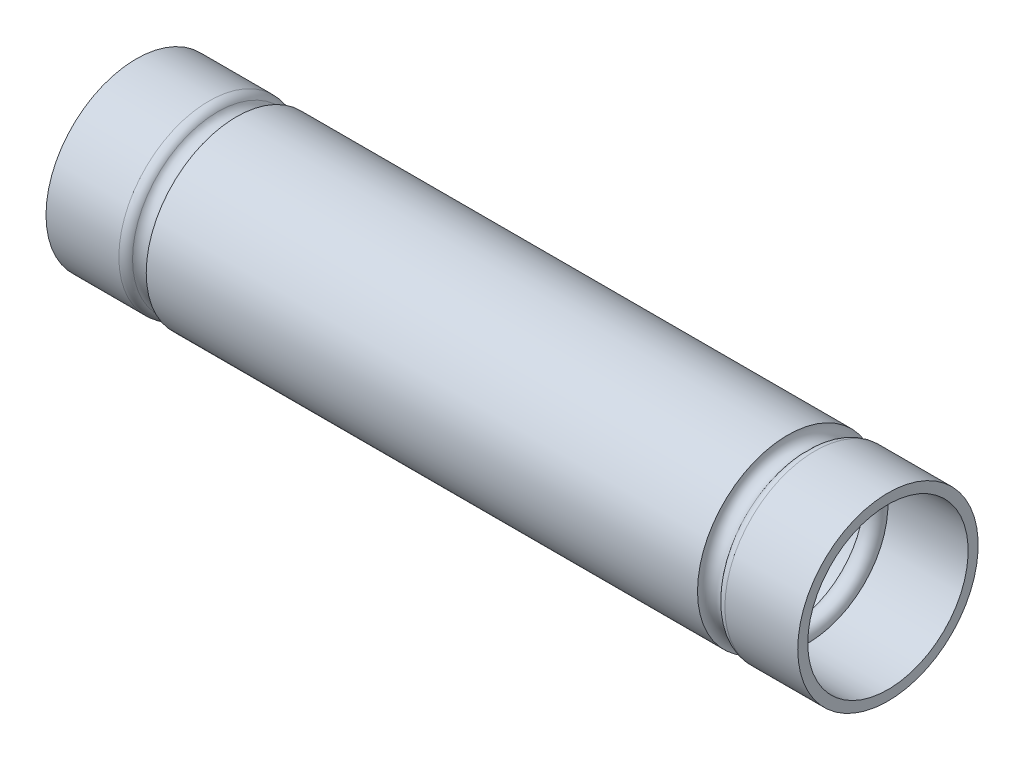
ISO-10303-21;
HEADER;
FILE_DESCRIPTION(('STEP AP214'),'2;1');
FILE_NAME('part.step','',(''),(''),'','','');
FILE_SCHEMA(('AUTOMOTIVE_DESIGN { 1 0 10303 214 1 1 1 1 }'));
ENDSEC;
DATA;
#1=APPLICATION_CONTEXT('core data for automotive mechanical design processes');
#2=APPLICATION_PROTOCOL_DEFINITION('international standard','automotive_design',2000,#1);
#3=PRODUCT_CONTEXT('',#1,'mechanical');
#4=PRODUCT('Part','Part','',(#3));
#5=PRODUCT_RELATED_PRODUCT_CATEGORY('part','',(#4));
#6=PRODUCT_DEFINITION_FORMATION('','',#4);
#7=PRODUCT_DEFINITION_CONTEXT('part definition',#1,'design');
#8=PRODUCT_DEFINITION('design','',#6,#7);
#9=PRODUCT_DEFINITION_SHAPE('','',#8);
#10=(LENGTH_UNIT() NAMED_UNIT(*) SI_UNIT(.MILLI.,.METRE.));
#11=(NAMED_UNIT(*) PLANE_ANGLE_UNIT() SI_UNIT($,.RADIAN.));
#12=(NAMED_UNIT(*) SI_UNIT($,.STERADIAN.) SOLID_ANGLE_UNIT());
#13=UNCERTAINTY_MEASURE_WITH_UNIT(LENGTH_MEASURE(1.E-05),#10,'distance_accuracy_value','');
#14=(GEOMETRIC_REPRESENTATION_CONTEXT(3) GLOBAL_UNCERTAINTY_ASSIGNED_CONTEXT((#13)) GLOBAL_UNIT_ASSIGNED_CONTEXT((#10,
#11,#12)) REPRESENTATION_CONTEXT('',''));
#15=CARTESIAN_POINT('',(0.,0.,0.));
#16=DIRECTION('',(0.,0.,1.));
#17=DIRECTION('',(1.,0.,0.));
#18=AXIS2_PLACEMENT_3D('',#15,#16,#17);
#19=CARTESIAN_POINT('',(33.0000000000164,0.,0.));
#20=DIRECTION('',(-1.,0.,0.));
#21=DIRECTION('',(0.,0.,1.));
#22=AXIS2_PLACEMENT_3D('',#19,#20,#21);
#23=TOROIDAL_SURFACE('',#22,4.00000000000052,0.5);
#24=CARTESIAN_POINT('',(32.5000000000164,0.,0.));
#25=DIRECTION('',(-1.,0.,0.));
#26=DIRECTION('',(0.,0.,1.));
#27=AXIS2_PLACEMENT_3D('',#24,#25,#26);
#28=CIRCLE('',#27,4.00000000000053);
#29=CARTESIAN_POINT('',(32.5000000000164,0.,4.00000000000053));
#30=VERTEX_POINT('',#29);
#31=EDGE_CURVE('E67',#30,#30,#28,.T.);
#32=ORIENTED_EDGE('',*,*,#31,.T.);
#33=EDGE_LOOP('',(#32));
#34=FACE_BOUND('',#33,.T.);
#35=CARTESIAN_POINT('',(33.5000000000164,0.,0.));
#36=DIRECTION('',(-1.,0.,0.));
#37=DIRECTION('',(0.,0.,1.));
#38=AXIS2_PLACEMENT_3D('',#35,#36,#37);
#39=CIRCLE('',#38,4.00000000000052);
#40=CARTESIAN_POINT('',(33.5000000000164,0.,4.00000000000052));
#41=VERTEX_POINT('',#40);
#42=EDGE_CURVE('E103',#41,#41,#39,.T.);
#43=ORIENTED_EDGE('',*,*,#42,.F.);
#44=EDGE_LOOP('',(#43));
#45=FACE_BOUND('',#44,.T.);
#46=ADVANCED_FACE('F43',(#34,#45),#23,.T.);
#47=CARTESIAN_POINT('',(37.4999999999977,0.,0.));
#48=DIRECTION('',(-1.,0.,0.));
#49=DIRECTION('',(0.,0.,1.));
#50=AXIS2_PLACEMENT_3D('',#47,#48,#49);
#51=CYLINDRICAL_SURFACE('',#50,4.00000000000053);
#52=CARTESIAN_POINT('',(4.99999999998123,0.,0.));
#53=DIRECTION('',(-1.,0.,0.));
#54=DIRECTION('',(0.,0.,1.));
#55=AXIS2_PLACEMENT_3D('',#52,#53,#54);
#56=CIRCLE('',#55,4.00000000000053);
#57=CARTESIAN_POINT('',(4.99999999998123,0.,4.00000000000053));
#58=VERTEX_POINT('',#57);
#59=EDGE_CURVE('E71',#58,#58,#56,.T.);
#60=ORIENTED_EDGE('',*,*,#59,.T.);
#61=EDGE_LOOP('',(#60));
#62=FACE_BOUND('',#61,.T.);
#63=ORIENTED_EDGE('',*,*,#31,.F.);
#64=EDGE_LOOP('',(#63));
#65=FACE_BOUND('',#64,.T.);
#66=ADVANCED_FACE('F112',(#62,#65),#51,.F.);
#67=CARTESIAN_POINT('',(4.49999999998124,0.,0.));
#68=DIRECTION('',(-1.,0.,0.));
#69=DIRECTION('',(0.,0.,1.));
#70=AXIS2_PLACEMENT_3D('',#67,#68,#69);
#71=TOROIDAL_SURFACE('',#70,4.00000000000053,0.5);
#72=CARTESIAN_POINT('',(3.99999999998123,0.,0.));
#73=DIRECTION('',(-1.,0.,0.));
#74=DIRECTION('',(0.,0.,1.));
#75=AXIS2_PLACEMENT_3D('',#72,#73,#74);
#76=CIRCLE('',#75,4.00000000000053);
#77=CARTESIAN_POINT('',(3.99999999998123,0.,4.00000000000053));
#78=VERTEX_POINT('',#77);
#79=EDGE_CURVE('E75',#78,#78,#76,.T.);
#80=ORIENTED_EDGE('',*,*,#79,.T.);
#81=EDGE_LOOP('',(#80));
#82=FACE_BOUND('',#81,.T.);
#83=ORIENTED_EDGE('',*,*,#59,.F.);
#84=EDGE_LOOP('',(#83));
#85=FACE_BOUND('',#84,.T.);
#86=ADVANCED_FACE('F118',(#82,#85),#71,.T.);
#87=CARTESIAN_POINT('',(37.4999999999977,0.,0.));
#88=DIRECTION('',(-1.,0.,0.));
#89=DIRECTION('',(0.,0.,1.));
#90=AXIS2_PLACEMENT_3D('',#87,#88,#89);
#91=CYLINDRICAL_SURFACE('',#90,4.00000000000053);
#92=CARTESIAN_POINT('',(0.,0.,0.));
#93=DIRECTION('',(-1.,0.,0.));
#94=DIRECTION('',(0.,0.,1.));
#95=AXIS2_PLACEMENT_3D('',#92,#93,#94);
#96=CIRCLE('',#95,4.00000000000053);
#97=CARTESIAN_POINT('',(0.,0.,4.00000000000053));
#98=VERTEX_POINT('',#97);
#99=EDGE_CURVE('E79',#98,#98,#96,.T.);
#100=ORIENTED_EDGE('',*,*,#99,.T.);
#101=EDGE_LOOP('',(#100));
#102=FACE_BOUND('',#101,.T.);
#103=ORIENTED_EDGE('',*,*,#79,.F.);
#104=EDGE_LOOP('',(#103));
#105=FACE_BOUND('',#104,.T.);
#106=ADVANCED_FACE('F162',(#102,#105),#91,.F.);
#107=CARTESIAN_POINT('',(0.,4.00000000000053,0.));
#108=DIRECTION('',(-1.,0.,0.));
#109=DIRECTION('',(0.,0.,1.));
#110=AXIS2_PLACEMENT_3D('',#107,#108,#109);
#111=PLANE('',#110);
#112=CARTESIAN_POINT('',(0.,0.,0.));
#113=DIRECTION('',(-1.,0.,0.));
#114=DIRECTION('',(0.,0.,1.));
#115=AXIS2_PLACEMENT_3D('',#112,#113,#114);
#116=CIRCLE('',#115,4.50000000000052);
#117=CARTESIAN_POINT('',(0.,0.,4.50000000000052));
#118=VERTEX_POINT('',#117);
#119=EDGE_CURVE('E83',#118,#118,#116,.T.);
#120=ORIENTED_EDGE('',*,*,#119,.T.);
#121=EDGE_LOOP('',(#120));
#122=FACE_BOUND('',#121,.T.);
#123=ORIENTED_EDGE('',*,*,#99,.F.);
#124=EDGE_LOOP('',(#123));
#125=FACE_BOUND('',#124,.T.);
#126=ADVANCED_FACE('F157',(#122,#125),#111,.T.);
#127=CARTESIAN_POINT('',(37.4999999999977,0.,0.));
#128=DIRECTION('',(-1.,0.,0.));
#129=DIRECTION('',(0.,0.,1.));
#130=AXIS2_PLACEMENT_3D('',#127,#128,#129);
#131=CYLINDRICAL_SURFACE('',#130,4.50000000000052);
#132=CARTESIAN_POINT('',(3.63397622195295,0.,0.));
#133=DIRECTION('',(1.,0.,0.));
#134=DIRECTION('',(0.,0.,-1.));
#135=AXIS2_PLACEMENT_3D('',#132,#133,#134);
#136=CIRCLE('',#135,4.50000000000052);
#137=CARTESIAN_POINT('',(3.63397622195295,0.,-4.50000000000052));
#138=VERTEX_POINT('',#137);
#139=EDGE_CURVE('E51',#138,#138,#136,.F.);
#140=ORIENTED_EDGE('',*,*,#139,.T.);
#141=EDGE_LOOP('',(#140));
#142=FACE_BOUND('',#141,.T.);
#143=ORIENTED_EDGE('',*,*,#119,.F.);
#144=EDGE_LOOP('',(#143));
#145=FACE_BOUND('',#144,.T.);
#146=ADVANCED_FACE('F152',(#142,#145),#131,.T.);
#147=CARTESIAN_POINT('',(4.49999999998123,0.,0.));
#148=DIRECTION('',(-1.,0.,0.));
#149=DIRECTION('',(0.,0.,1.));
#150=AXIS2_PLACEMENT_3D('',#147,#148,#149);
#151=TOROIDAL_SURFACE('',#150,4.50000000000052,0.5);
#152=CARTESIAN_POINT('',(4.06698689164988,0.,0.));
#153=DIRECTION('',(1.,0.,0.));
#154=DIRECTION('',(0.,0.,-1.));
#155=AXIS2_PLACEMENT_3D('',#152,#153,#154);
#156=CIRCLE('',#155,4.25000070397509);
#157=CARTESIAN_POINT('',(4.06698689164988,0.,-4.25000070397509));
#158=VERTEX_POINT('',#157);
#159=EDGE_CURVE('E10',#158,#158,#156,.T.);
#160=ORIENTED_EDGE('',*,*,#159,.T.);
#161=EDGE_LOOP('',(#160));
#162=FACE_BOUND('',#161,.T.);
#163=CARTESIAN_POINT('',(4.99999999998123,0.,0.));
#164=DIRECTION('',(-1.,0.,0.));
#165=DIRECTION('',(0.,0.,1.));
#166=AXIS2_PLACEMENT_3D('',#163,#164,#165);
#167=CIRCLE('',#166,4.50000000000052);
#168=CARTESIAN_POINT('',(4.99999999998123,0.,4.50000000000052));
#169=VERTEX_POINT('',#168);
#170=EDGE_CURVE('E87',#169,#169,#167,.T.);
#171=ORIENTED_EDGE('',*,*,#170,.T.);
#172=EDGE_LOOP('',(#171));
#173=FACE_BOUND('',#172,.T.);
#174=ADVANCED_FACE('F147',(#162,#173),#151,.F.);
#175=CARTESIAN_POINT('',(37.4999999999977,0.,0.));
#176=DIRECTION('',(-1.,0.,0.));
#177=DIRECTION('',(0.,0.,1.));
#178=AXIS2_PLACEMENT_3D('',#175,#176,#177);
#179=CYLINDRICAL_SURFACE('',#178,4.50000000000052);
#180=CARTESIAN_POINT('',(32.5000000000164,0.,0.));
#181=DIRECTION('',(-1.,0.,0.));
#182=DIRECTION('',(0.,0.,1.));
#183=AXIS2_PLACEMENT_3D('',#180,#181,#182);
#184=CIRCLE('',#183,4.50000000000053);
#185=CARTESIAN_POINT('',(32.5000000000164,0.,4.50000000000053));
#186=VERTEX_POINT('',#185);
#187=EDGE_CURVE('E91',#186,#186,#184,.T.);
#188=ORIENTED_EDGE('',*,*,#187,.T.);
#189=EDGE_LOOP('',(#188));
#190=FACE_BOUND('',#189,.T.);
#191=ORIENTED_EDGE('',*,*,#170,.F.);
#192=EDGE_LOOP('',(#191));
#193=FACE_BOUND('',#192,.T.);
#194=ADVANCED_FACE('F141',(#190,#193),#179,.T.);
#195=CARTESIAN_POINT('',(33.0000000000164,0.,0.));
#196=DIRECTION('',(-1.,0.,0.));
#197=DIRECTION('',(0.,0.,1.));
#198=AXIS2_PLACEMENT_3D('',#195,#196,#197);
#199=TOROIDAL_SURFACE('',#198,4.50000000000023,0.5);
#200=CARTESIAN_POINT('',(33.4330131083478,0.,0.));
#201=DIRECTION('',(-1.,0.,0.));
#202=DIRECTION('',(0.,0.,1.));
#203=AXIS2_PLACEMENT_3D('',#200,#201,#202);
#204=CIRCLE('',#203,4.25000070397485);
#205=CARTESIAN_POINT('',(33.4330131083478,0.,4.25000070397485));
#206=VERTEX_POINT('',#205);
#207=EDGE_CURVE('E61',#206,#206,#204,.T.);
#208=ORIENTED_EDGE('',*,*,#207,.T.);
#209=EDGE_LOOP('',(#208));
#210=FACE_BOUND('',#209,.T.);
#211=ORIENTED_EDGE('',*,*,#187,.F.);
#212=EDGE_LOOP('',(#211));
#213=FACE_BOUND('',#212,.T.);
#214=ADVANCED_FACE('F137',(#210,#213),#199,.F.);
#215=CARTESIAN_POINT('',(37.4999999999977,0.,0.));
#216=DIRECTION('',(-1.,0.,0.));
#217=DIRECTION('',(0.,0.,1.));
#218=AXIS2_PLACEMENT_3D('',#215,#216,#217);
#219=CYLINDRICAL_SURFACE('',#218,4.50000000000037);
#220=CARTESIAN_POINT('',(33.8660237780448,0.,0.));
#221=DIRECTION('',(1.,0.,0.));
#222=DIRECTION('',(0.,0.,-1.));
#223=AXIS2_PLACEMENT_3D('',#220,#221,#222);
#224=CIRCLE('',#223,4.50000000000037);
#225=CARTESIAN_POINT('',(33.8660237780448,0.,-4.50000000000037));
#226=VERTEX_POINT('',#225);
#227=EDGE_CURVE('E56',#226,#226,#224,.T.);
#228=ORIENTED_EDGE('',*,*,#227,.T.);
#229=EDGE_LOOP('',(#228));
#230=FACE_BOUND('',#229,.T.);
#231=CARTESIAN_POINT('',(37.4999999999977,0.,0.));
#232=DIRECTION('',(-1.,0.,0.));
#233=DIRECTION('',(0.,0.,1.));
#234=AXIS2_PLACEMENT_3D('',#231,#232,#233);
#235=CIRCLE('',#234,4.50000000000052);
#236=CARTESIAN_POINT('',(37.4999999999977,0.,4.50000000000052));
#237=VERTEX_POINT('',#236);
#238=EDGE_CURVE('E95',#237,#237,#235,.T.);
#239=ORIENTED_EDGE('',*,*,#238,.T.);
#240=EDGE_LOOP('',(#239));
#241=FACE_BOUND('',#240,.T.);
#242=ADVANCED_FACE('F140',(#230,#241),#219,.T.);
#243=CARTESIAN_POINT('',(37.4999999999977,4.50000000000052,0.));
#244=DIRECTION('',(1.,0.,0.));
#245=DIRECTION('',(0.,0.,-1.));
#246=AXIS2_PLACEMENT_3D('',#243,#244,#245);
#247=PLANE('',#246);
#248=CARTESIAN_POINT('',(37.4999999999977,0.,0.));
#249=DIRECTION('',(-1.,0.,0.));
#250=DIRECTION('',(0.,0.,1.));
#251=AXIS2_PLACEMENT_3D('',#248,#249,#250);
#252=CIRCLE('',#251,4.00000000000052);
#253=CARTESIAN_POINT('',(37.4999999999977,0.,4.00000000000052));
#254=VERTEX_POINT('',#253);
#255=EDGE_CURVE('E99',#254,#254,#252,.T.);
#256=ORIENTED_EDGE('',*,*,#255,.T.);
#257=EDGE_LOOP('',(#256));
#258=FACE_BOUND('',#257,.T.);
#259=ORIENTED_EDGE('',*,*,#238,.F.);
#260=EDGE_LOOP('',(#259));
#261=FACE_BOUND('',#260,.T.);
#262=ADVANCED_FACE('F131',(#258,#261),#247,.T.);
#263=CARTESIAN_POINT('',(37.4999999999977,0.,0.));
#264=DIRECTION('',(-1.,0.,0.));
#265=DIRECTION('',(0.,0.,1.));
#266=AXIS2_PLACEMENT_3D('',#263,#264,#265);
#267=CYLINDRICAL_SURFACE('',#266,4.00000000000052);
#268=ORIENTED_EDGE('',*,*,#42,.T.);
#269=EDGE_LOOP('',(#268));
#270=FACE_BOUND('',#269,.T.);
#271=ORIENTED_EDGE('',*,*,#255,.F.);
#272=EDGE_LOOP('',(#271));
#273=FACE_BOUND('',#272,.T.);
#274=ADVANCED_FACE('F108',(#270,#273),#267,.F.);
#275=CARTESIAN_POINT('',(33.8660237780448,0.,0.));
#276=DIRECTION('',(1.,0.,0.));
#277=DIRECTION('',(0.,0.,-1.));
#278=AXIS2_PLACEMENT_3D('',#275,#276,#277);
#279=TOROIDAL_SURFACE('',#278,4.00000281589045,0.499997184109999);
#280=ORIENTED_EDGE('',*,*,#227,.F.);
#281=EDGE_LOOP('',(#280));
#282=FACE_BOUND('',#281,.T.);
#283=ORIENTED_EDGE('',*,*,#207,.F.);
#284=EDGE_LOOP('',(#283));
#285=FACE_BOUND('',#284,.T.);
#286=ADVANCED_FACE('F122',(#282,#285),#279,.T.);
#287=CARTESIAN_POINT('',(3.63397622195295,0.,0.));
#288=DIRECTION('',(1.,0.,0.));
#289=DIRECTION('',(0.,0.,-1.));
#290=AXIS2_PLACEMENT_3D('',#287,#288,#289);
#291=TOROIDAL_SURFACE('',#290,4.0000028158906,0.499997184109999);
#292=ORIENTED_EDGE('',*,*,#159,.F.);
#293=EDGE_LOOP('',(#292));
#294=FACE_BOUND('',#293,.T.);
#295=ORIENTED_EDGE('',*,*,#139,.F.);
#296=EDGE_LOOP('',(#295));
#297=FACE_BOUND('',#296,.T.);
#298=ADVANCED_FACE('F45',(#294,#297),#291,.T.);
#299=CLOSED_SHELL('',(#46,#66,#86,#106,#126,#146,#174,#194,#214,#242,#262,#274,#286,#298));
#300=MANIFOLD_SOLID_BREP('B2',#299);
#301=ADVANCED_BREP_SHAPE_REPRESENTATION('',(#18,#300),#14);
#302=SHAPE_DEFINITION_REPRESENTATION(#9,#301);
ENDSEC;
END-ISO-10303-21;
